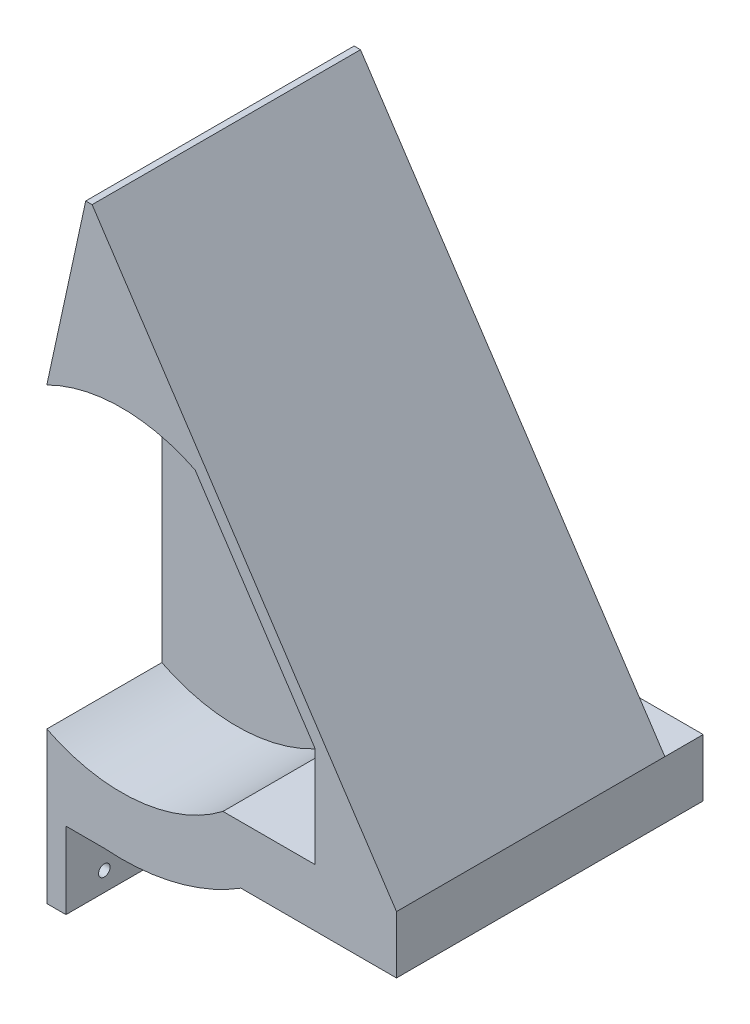
ISO-10303-21;
HEADER;
FILE_DESCRIPTION(('STEP AP214'),'2;1');
FILE_NAME('part.step','',(''),(''),'','','');
FILE_SCHEMA(('AUTOMOTIVE_DESIGN { 1 0 10303 214 1 1 1 1 }'));
ENDSEC;
DATA;
#1=APPLICATION_CONTEXT('core data for automotive mechanical design processes');
#2=APPLICATION_PROTOCOL_DEFINITION('international standard','automotive_design',2000,#1);
#3=PRODUCT_CONTEXT('',#1,'mechanical');
#4=PRODUCT('Part','Part','',(#3));
#5=PRODUCT_RELATED_PRODUCT_CATEGORY('part','',(#4));
#6=PRODUCT_DEFINITION_FORMATION('','',#4);
#7=PRODUCT_DEFINITION_CONTEXT('part definition',#1,'design');
#8=PRODUCT_DEFINITION('design','',#6,#7);
#9=PRODUCT_DEFINITION_SHAPE('','',#8);
#10=(LENGTH_UNIT() NAMED_UNIT(*) SI_UNIT(.MILLI.,.METRE.));
#11=(NAMED_UNIT(*) PLANE_ANGLE_UNIT() SI_UNIT($,.RADIAN.));
#12=(NAMED_UNIT(*) SI_UNIT($,.STERADIAN.) SOLID_ANGLE_UNIT());
#13=UNCERTAINTY_MEASURE_WITH_UNIT(LENGTH_MEASURE(1.E-05),#10,'distance_accuracy_value','');
#14=(GEOMETRIC_REPRESENTATION_CONTEXT(3) GLOBAL_UNCERTAINTY_ASSIGNED_CONTEXT((#13)) GLOBAL_UNIT_ASSIGNED_CONTEXT((#10,
#11,#12)) REPRESENTATION_CONTEXT('',''));
#15=CARTESIAN_POINT('',(0.,0.,0.));
#16=DIRECTION('',(0.,0.,1.));
#17=DIRECTION('',(1.,0.,0.));
#18=AXIS2_PLACEMENT_3D('',#15,#16,#17);
#19=CARTESIAN_POINT('',(15.,-23.7978478395397,-70.0000000000001));
#20=DIRECTION('',(0.,1.,0.));
#21=DIRECTION('',(0.,0.,1.));
#22=AXIS2_PLACEMENT_3D('',#19,#20,#21);
#23=PLANE('',#22);
#24=DIRECTION('',(0.,0.,1.));
#25=VECTOR('',#24,1.);
#26=CARTESIAN_POINT('',(15.,-23.7978478395397,-80.));
#27=LINE('',#26,#25);
#28=CARTESIAN_POINT('',(15.,-23.7978478395397,-80.0000000000001));
#29=VERTEX_POINT('',#28);
#30=CARTESIAN_POINT('',(15.,-23.7978478395397,0.));
#31=VERTEX_POINT('',#30);
#32=EDGE_CURVE('E220',#29,#31,#27,.T.);
#33=ORIENTED_EDGE('',*,*,#32,.T.);
#34=DIRECTION('',(-1.,0.,0.));
#35=VECTOR('',#34,1.);
#36=CARTESIAN_POINT('',(15.,-23.7978478395397,0.));
#37=LINE('',#36,#35);
#38=CARTESIAN_POINT('',(5.,-23.7978478395397,0.));
#39=VERTEX_POINT('',#38);
#40=EDGE_CURVE('E66',#31,#39,#37,.T.);
#41=ORIENTED_EDGE('',*,*,#40,.T.);
#42=DIRECTION('',(0.,0.,1.));
#43=VECTOR('',#42,1.);
#44=CARTESIAN_POINT('',(5.,-23.7978478395397,0.));
#45=LINE('',#44,#43);
#46=CARTESIAN_POINT('',(5.00000000000001,-23.7978478395397,-80.0000000000001));
#47=VERTEX_POINT('',#46);
#48=EDGE_CURVE('E61',#47,#39,#45,.T.);
#49=ORIENTED_EDGE('',*,*,#48,.F.);
#50=DIRECTION('',(-1.,0.,0.));
#51=VECTOR('',#50,1.);
#52=CARTESIAN_POINT('',(15.,-23.7978478395397,-80.0000000000001));
#53=LINE('',#52,#51);
#54=EDGE_CURVE('E200',#29,#47,#53,.T.);
#55=ORIENTED_EDGE('',*,*,#54,.F.);
#56=EDGE_LOOP('',(#33,#41,#49,#55));
#57=FACE_BOUND('',#56,.T.);
#58=ADVANCED_FACE('F45',(#57),#23,.F.);
#59=CARTESIAN_POINT('',(30.,0.,0.));
#60=DIRECTION('',(0.,0.,-1.));
#61=DIRECTION('',(0.,1.,0.));
#62=AXIS2_PLACEMENT_3D('',#59,#60,#61);
#63=PLANE('',#62);
#64=DIRECTION('',(0.,-1.,0.));
#65=VECTOR('',#64,1.);
#66=CARTESIAN_POINT('',(0.,0.,0.));
#67=LINE('',#66,#65);
#68=CARTESIAN_POINT('',(0.,-4.35229791402416,0.));
#69=VERTEX_POINT('',#68);
#70=CARTESIAN_POINT('',(0.,-43.7978478395397,0.));
#71=VERTEX_POINT('',#70);
#72=EDGE_CURVE('E301',#69,#71,#67,.T.);
#73=ORIENTED_EDGE('',*,*,#72,.T.);
#74=DIRECTION('',(-1.,0.,0.));
#75=VECTOR('',#74,1.);
#76=CARTESIAN_POINT('',(0.,-43.7978478395397,0.));
#77=LINE('',#76,#75);
#78=CARTESIAN_POINT('',(5.,-43.7978478395397,0.));
#79=VERTEX_POINT('',#78);
#80=EDGE_CURVE('E187',#79,#71,#77,.T.);
#81=ORIENTED_EDGE('',*,*,#80,.F.);
#82=DIRECTION('',(0.,1.,0.));
#83=VECTOR('',#82,1.);
#84=CARTESIAN_POINT('',(5.,-43.7978478395397,0.));
#85=LINE('',#84,#83);
#86=EDGE_CURVE('E195',#79,#39,#85,.T.);
#87=ORIENTED_EDGE('',*,*,#86,.T.);
#88=ORIENTED_EDGE('',*,*,#40,.F.);
#89=CARTESIAN_POINT('',(19.5000000000004,34.5000000000002,0.));
#90=DIRECTION('',(0.,0.,1.));
#91=DIRECTION('',(1.,0.,0.));
#92=AXIS2_PLACEMENT_3D('',#89,#90,#91);
#93=CIRCLE('',#92,58.471266984068);
#94=CARTESIAN_POINT('',(50.6229668046309,-15.,0.));
#95=VERTEX_POINT('',#94);
#96=EDGE_CURVE('E209',#31,#95,#93,.T.);
#97=ORIENTED_EDGE('',*,*,#96,.T.);
#98=DIRECTION('',(1.,0.,0.));
#99=VECTOR('',#98,1.);
#100=CARTESIAN_POINT('',(0.,-15.,0.));
#101=LINE('',#100,#99);
#102=CARTESIAN_POINT('',(91.2114741888743,-15.,0.));
#103=VERTEX_POINT('',#102);
#104=EDGE_CURVE('E204',#95,#103,#101,.T.);
#105=ORIENTED_EDGE('',*,*,#104,.T.);
#106=DIRECTION('',(0.,1.,0.));
#107=VECTOR('',#106,1.);
#108=CARTESIAN_POINT('',(91.2114741888743,-170.,0.));
#109=LINE('',#108,#107);
#110=CARTESIAN_POINT('',(91.2114741888743,0.,0.));
#111=VERTEX_POINT('',#110);
#112=EDGE_CURVE('E225',#103,#111,#109,.T.);
#113=ORIENTED_EDGE('',*,*,#112,.T.);
#114=DIRECTION('',(-0.551769207168103,0.833996847728505,0.));
#115=VECTOR('',#114,1.);
#116=CARTESIAN_POINT('',(11.8199212825175,120.,0.));
#117=LINE('',#116,#115);
#118=CARTESIAN_POINT('',(11.8199212825175,120.,0.));
#119=VERTEX_POINT('',#118);
#120=EDGE_CURVE('E267',#111,#119,#117,.T.);
#121=ORIENTED_EDGE('',*,*,#120,.T.);
#122=DIRECTION('',(-1.,0.,0.));
#123=VECTOR('',#122,1.);
#124=CARTESIAN_POINT('',(0.,120.,0.));
#125=LINE('',#124,#123);
#126=CARTESIAN_POINT('',(10.1536648631914,120.,0.));
#127=VERTEX_POINT('',#126);
#128=EDGE_CURVE('E260',#119,#127,#125,.T.);
#129=ORIENTED_EDGE('',*,*,#128,.T.);
#130=DIRECTION('',(0.212686858193503,0.977120412411785,0.));
#131=VECTOR('',#130,1.);
#132=CARTESIAN_POINT('',(-15.2441237420009,3.3181425169458,0.));
#133=LINE('',#132,#131);
#134=CARTESIAN_POINT('',(0.,73.3522979140246,0.));
#135=VERTEX_POINT('',#134);
#136=EDGE_CURVE('E254',#135,#127,#133,.T.);
#137=ORIENTED_EDGE('',*,*,#136,.F.);
#138=CARTESIAN_POINT('',(19.5000000000004,34.5000000000002,0.));
#139=DIRECTION('',(0.,0.,1.));
#140=DIRECTION('',(1.,0.,0.));
#141=AXIS2_PLACEMENT_3D('',#138,#139,#140);
#142=CIRCLE('',#141,43.471266984068);
#143=CARTESIAN_POINT('',(38.6845798514309,73.5090111272283,0.));
#144=VERTEX_POINT('',#143);
#145=EDGE_CURVE('E257',#135,#144,#142,.F.);
#146=ORIENTED_EDGE('',*,*,#145,.T.);
#147=DIRECTION('',(0.551769207168103,-0.833996847728505,0.));
#148=VECTOR('',#147,1.);
#149=CARTESIAN_POINT('',(87.3178677347752,0.,0.));
#150=LINE('',#149,#148);
#151=CARTESIAN_POINT('',(70.,26.1758846136216,0.));
#152=VERTEX_POINT('',#151);
#153=EDGE_CURVE('E265',#144,#152,#150,.T.);
#154=ORIENTED_EDGE('',*,*,#153,.T.);
#155=DIRECTION('',(0.,-1.,0.));
#156=VECTOR('',#155,1.);
#157=CARTESIAN_POINT('',(70.,26.1758846136216,0.));
#158=LINE('',#157,#156);
#159=CARTESIAN_POINT('',(70.,0.,0.));
#160=VERTEX_POINT('',#159);
#161=EDGE_CURVE('E235',#152,#160,#158,.T.);
#162=ORIENTED_EDGE('',*,*,#161,.T.);
#163=DIRECTION('',(-1.,0.,0.));
#164=VECTOR('',#163,1.);
#165=CARTESIAN_POINT('',(30.,0.,0.));
#166=LINE('',#165,#164);
#167=CARTESIAN_POINT('',(45.9480822215926,0.,0.));
#168=VERTEX_POINT('',#167);
#169=EDGE_CURVE('E11',#160,#168,#166,.T.);
#170=ORIENTED_EDGE('',*,*,#169,.T.);
#171=CARTESIAN_POINT('',(19.5000000000004,34.5000000000002,0.));
#172=DIRECTION('',(0.,0.,1.));
#173=DIRECTION('',(1.,0.,0.));
#174=AXIS2_PLACEMENT_3D('',#171,#172,#173);
#175=CIRCLE('',#174,43.471266984068);
#176=EDGE_CURVE('E275',#69,#168,#175,.T.);
#177=ORIENTED_EDGE('',*,*,#176,.F.);
#178=EDGE_LOOP('',(#73,#81,#87,#88,#97,#105,#113,#121,#129,#137,#146,#154,#162,#170,#177));
#179=FACE_BOUND('',#178,.T.);
#180=ADVANCED_FACE('F47',(#179),#63,.F.);
#181=CARTESIAN_POINT('',(91.2114741888743,-170.,-80.0000000000001));
#182=DIRECTION('',(-1.,0.,0.));
#183=DIRECTION('',(0.,0.,1.));
#184=AXIS2_PLACEMENT_3D('',#181,#182,#183);
#185=PLANE('',#184);
#186=DIRECTION('',(0.,0.,1.));
#187=VECTOR('',#186,1.);
#188=CARTESIAN_POINT('',(91.2114741888743,-15.,-80.));
#189=LINE('',#188,#187);
#190=CARTESIAN_POINT('',(91.2114741888743,-15.,-80.0000000000001));
#191=VERTEX_POINT('',#190);
#192=EDGE_CURVE('E217',#191,#103,#189,.T.);
#193=ORIENTED_EDGE('',*,*,#192,.F.);
#194=DIRECTION('',(0.,1.,0.));
#195=VECTOR('',#194,1.);
#196=CARTESIAN_POINT('',(91.2114741888743,-170.,-80.0000000000001));
#197=LINE('',#196,#195);
#198=CARTESIAN_POINT('',(91.2114741888743,0.,-80.0000000000001));
#199=VERTEX_POINT('',#198);
#200=EDGE_CURVE('E224',#191,#199,#197,.T.);
#201=ORIENTED_EDGE('',*,*,#200,.T.);
#202=DIRECTION('',(0.,0.,1.));
#203=VECTOR('',#202,1.);
#204=CARTESIAN_POINT('',(91.2114741888743,0.,-80.));
#205=LINE('',#204,#203);
#206=CARTESIAN_POINT('',(91.2114741888743,0.,-70.));
#207=VERTEX_POINT('',#206);
#208=EDGE_CURVE('E219',#199,#207,#205,.T.);
#209=ORIENTED_EDGE('',*,*,#208,.T.);
#210=DIRECTION('',(0.,0.,-1.));
#211=VECTOR('',#210,1.);
#212=CARTESIAN_POINT('',(91.2114741888743,0.,0.));
#213=LINE('',#212,#211);
#214=EDGE_CURVE('E271',#111,#207,#213,.T.);
#215=ORIENTED_EDGE('',*,*,#214,.F.);
#216=ORIENTED_EDGE('',*,*,#112,.F.);
#217=EDGE_LOOP('',(#193,#201,#209,#215,#216));
#218=FACE_BOUND('',#217,.T.);
#219=ADVANCED_FACE('F323',(#218),#185,.F.);
#220=CARTESIAN_POINT('',(0.,-100.282814982748,-32.0135944600556));
#221=DIRECTION('',(1.,0.,0.));
#222=DIRECTION('',(0.,0.,-1.));
#223=AXIS2_PLACEMENT_3D('',#220,#221,#222);
#224=PLANE('',#223);
#225=CARTESIAN_POINT('',(0.,-38.7978478395397,-70.0000000000001));
#226=DIRECTION('',(1.,0.,0.));
#227=DIRECTION('',(0.,0.,-1.));
#228=AXIS2_PLACEMENT_3D('',#225,#226,#227);
#229=CIRCLE('',#228,1.5);
#230=CARTESIAN_POINT('',(0.,-38.7978478395397,-71.5000000000001));
#231=VERTEX_POINT('',#230);
#232=EDGE_CURVE('E189',#231,#231,#229,.T.);
#233=ORIENTED_EDGE('',*,*,#232,.T.);
#234=EDGE_LOOP('',(#233));
#235=FACE_BOUND('',#234,.T.);
#236=CARTESIAN_POINT('',(0.,-38.7978478395397,-9.99999999999999));
#237=DIRECTION('',(1.,0.,0.));
#238=DIRECTION('',(0.,0.,-1.));
#239=AXIS2_PLACEMENT_3D('',#236,#237,#238);
#240=CIRCLE('',#239,1.5);
#241=CARTESIAN_POINT('',(0.,-38.7978478395397,-11.5));
#242=VERTEX_POINT('',#241);
#243=EDGE_CURVE('E426',#242,#242,#240,.T.);
#244=ORIENTED_EDGE('',*,*,#243,.T.);
#245=EDGE_LOOP('',(#244));
#246=FACE_BOUND('',#245,.T.);
#247=DIRECTION('',(0.,-1.,0.));
#248=VECTOR('',#247,1.);
#249=CARTESIAN_POINT('',(0.,120.,-80.0000000000001));
#250=LINE('',#249,#248);
#251=CARTESIAN_POINT('',(0.,0.,-80.0000000000001));
#252=VERTEX_POINT('',#251);
#253=CARTESIAN_POINT('',(0.,-43.7978478395397,-80.0000000000001));
#254=VERTEX_POINT('',#253);
#255=EDGE_CURVE('E162',#252,#254,#250,.T.);
#256=ORIENTED_EDGE('',*,*,#255,.T.);
#257=DIRECTION('',(0.,0.,-1.));
#258=VECTOR('',#257,1.);
#259=CARTESIAN_POINT('',(0.,-43.7978478395397,0.));
#260=LINE('',#259,#258);
#261=EDGE_CURVE('E167',#71,#254,#260,.T.);
#262=ORIENTED_EDGE('',*,*,#261,.F.);
#263=ORIENTED_EDGE('',*,*,#72,.F.);
#264=DIRECTION('',(0.,0.,-1.));
#265=VECTOR('',#264,1.);
#266=CARTESIAN_POINT('',(0.,-4.35229791402416,0.));
#267=LINE('',#266,#265);
#268=CARTESIAN_POINT('',(0.,-4.35229791402416,-30.));
#269=VERTEX_POINT('',#268);
#270=EDGE_CURVE('E283',#269,#69,#267,.F.);
#271=ORIENTED_EDGE('',*,*,#270,.F.);
#272=DIRECTION('',(0.,-1.,0.));
#273=VECTOR('',#272,1.);
#274=CARTESIAN_POINT('',(0.,70.,-30.));
#275=LINE('',#274,#273);
#276=CARTESIAN_POINT('',(0.,73.3522979140246,-30.));
#277=VERTEX_POINT('',#276);
#278=EDGE_CURVE('E287',#277,#269,#275,.T.);
#279=ORIENTED_EDGE('',*,*,#278,.F.);
#280=DIRECTION('',(0.,0.,1.));
#281=VECTOR('',#280,1.);
#282=CARTESIAN_POINT('',(0.,73.3522979140246,-270.));
#283=LINE('',#282,#281);
#284=CARTESIAN_POINT('',(0.,73.3522979140246,-70.0000000000001));
#285=VERTEX_POINT('',#284);
#286=EDGE_CURVE('E248',#285,#277,#283,.T.);
#287=ORIENTED_EDGE('',*,*,#286,.F.);
#288=DIRECTION('',(0.,-1.,0.));
#289=VECTOR('',#288,1.);
#290=CARTESIAN_POINT('',(0.,120.,-70.));
#291=LINE('',#290,#289);
#292=CARTESIAN_POINT('',(0.,0.,-70.0000000000001));
#293=VERTEX_POINT('',#292);
#294=EDGE_CURVE('E296',#285,#293,#291,.T.);
#295=ORIENTED_EDGE('',*,*,#294,.T.);
#296=DIRECTION('',(0.,0.,1.));
#297=VECTOR('',#296,1.);
#298=CARTESIAN_POINT('',(0.,0.,0.));
#299=LINE('',#298,#297);
#300=EDGE_CURVE('E54',#252,#293,#299,.T.);
#301=ORIENTED_EDGE('',*,*,#300,.F.);
#302=EDGE_LOOP('',(#256,#262,#263,#271,#279,#287,#295,#301));
#303=FACE_BOUND('',#302,.T.);
#304=ADVANCED_FACE('F164',(#235,#246,#303),#224,.F.);
#305=CARTESIAN_POINT('',(30.,0.,0.));
#306=DIRECTION('',(0.,-1.,0.));
#307=DIRECTION('',(0.,0.,-1.));
#308=AXIS2_PLACEMENT_3D('',#305,#306,#307);
#309=PLANE('',#308);
#310=ORIENTED_EDGE('',*,*,#208,.F.);
#311=DIRECTION('',(-1.,0.,0.));
#312=VECTOR('',#311,1.);
#313=CARTESIAN_POINT('',(30.,0.,-80.0000000000001));
#314=LINE('',#313,#312);
#315=EDGE_CURVE('E172',#199,#252,#314,.T.);
#316=ORIENTED_EDGE('',*,*,#315,.T.);
#317=ORIENTED_EDGE('',*,*,#300,.T.);
#318=DIRECTION('',(-1.,0.,0.));
#319=VECTOR('',#318,1.);
#320=CARTESIAN_POINT('',(0.,0.,-70.0000000000001));
#321=LINE('',#320,#319);
#322=EDGE_CURVE('E299',#207,#293,#321,.T.);
#323=ORIENTED_EDGE('',*,*,#322,.F.);
#324=EDGE_LOOP('',(#310,#316,#317,#323));
#325=FACE_BOUND('',#324,.T.);
#326=ADVANCED_FACE('F306',(#325),#309,.F.);
#327=CARTESIAN_POINT('',(87.3178677347752,0.,0.));
#328=DIRECTION('',(0.833996847728505,0.551769207168103,0.));
#329=DIRECTION('',(-0.551769207168104,0.833996847728505,0.));
#330=AXIS2_PLACEMENT_3D('',#327,#328,#329);
#331=PLANE('',#330);
#332=ORIENTED_EDGE('',*,*,#153,.F.);
#333=DIRECTION('',(0.,0.,-1.));
#334=VECTOR('',#333,1.);
#335=CARTESIAN_POINT('',(38.6845798514309,73.5090111272283,0.));
#336=LINE('',#335,#334);
#337=CARTESIAN_POINT('',(38.6845798514309,73.5090111272283,-30.));
#338=VERTEX_POINT('',#337);
#339=EDGE_CURVE('E238',#144,#338,#336,.T.);
#340=ORIENTED_EDGE('',*,*,#339,.T.);
#341=DIRECTION('',(0.551769207168103,-0.833996847728505,0.));
#342=VECTOR('',#341,1.);
#343=CARTESIAN_POINT('',(60.7340076946217,40.1813932091887,-30.));
#344=LINE('',#343,#342);
#345=CARTESIAN_POINT('',(70.,26.1758846136215,-30.));
#346=VERTEX_POINT('',#345);
#347=EDGE_CURVE('E243',#338,#346,#344,.T.);
#348=ORIENTED_EDGE('',*,*,#347,.T.);
#349=DIRECTION('',(0.,0.,-1.));
#350=VECTOR('',#349,1.);
#351=CARTESIAN_POINT('',(70.,26.1758846136215,-30.));
#352=LINE('',#351,#350);
#353=EDGE_CURVE('E240',#152,#346,#352,.T.);
#354=ORIENTED_EDGE('',*,*,#353,.F.);
#355=EDGE_LOOP('',(#332,#340,#348,#354));
#356=FACE_BOUND('',#355,.T.);
#357=ADVANCED_FACE('F368',(#356),#331,.F.);
#358=ORIENTED_EDGE('',*,*,#169,.F.);
#359=DIRECTION('',(0.,0.,1.));
#360=VECTOR('',#359,1.);
#361=CARTESIAN_POINT('',(70.,0.,-30.));
#362=LINE('',#361,#360);
#363=CARTESIAN_POINT('',(70.,0.,-30.));
#364=VERTEX_POINT('',#363);
#365=EDGE_CURVE('E294',#364,#160,#362,.T.);
#366=ORIENTED_EDGE('',*,*,#365,.F.);
#367=DIRECTION('',(1.,0.,0.));
#368=VECTOR('',#367,1.);
#369=CARTESIAN_POINT('',(0.,0.,-30.));
#370=LINE('',#369,#368);
#371=CARTESIAN_POINT('',(45.9480822215926,0.,-30.));
#372=VERTEX_POINT('',#371);
#373=EDGE_CURVE('E289',#372,#364,#370,.T.);
#374=ORIENTED_EDGE('',*,*,#373,.F.);
#375=DIRECTION('',(0.,0.,-1.));
#376=VECTOR('',#375,1.);
#377=CARTESIAN_POINT('',(45.9480822215926,0.,0.));
#378=LINE('',#377,#376);
#379=EDGE_CURVE('E285',#168,#372,#378,.T.);
#380=ORIENTED_EDGE('',*,*,#379,.F.);
#381=EDGE_LOOP('',(#358,#366,#374,#380));
#382=FACE_BOUND('',#381,.T.);
#383=ADVANCED_FACE('F350',(#382),#309,.F.);
#384=CARTESIAN_POINT('',(0.,0.,-30.));
#385=DIRECTION('',(0.,0.,1.));
#386=DIRECTION('',(1.,0.,0.));
#387=AXIS2_PLACEMENT_3D('',#384,#385,#386);
#388=PLANE('',#387);
#389=ORIENTED_EDGE('',*,*,#347,.F.);
#390=CARTESIAN_POINT('',(19.5000000000004,34.5000000000002,-30.));
#391=DIRECTION('',(0.,0.,1.));
#392=DIRECTION('',(1.,0.,0.));
#393=AXIS2_PLACEMENT_3D('',#390,#391,#392);
#394=CIRCLE('',#393,43.471266984068);
#395=EDGE_CURVE('E279',#338,#277,#394,.T.);
#396=ORIENTED_EDGE('',*,*,#395,.T.);
#397=ORIENTED_EDGE('',*,*,#278,.T.);
#398=EDGE_CURVE('E274',#269,#372,#394,.T.);
#399=ORIENTED_EDGE('',*,*,#398,.T.);
#400=ORIENTED_EDGE('',*,*,#373,.T.);
#401=DIRECTION('',(0.,1.,0.));
#402=VECTOR('',#401,1.);
#403=CARTESIAN_POINT('',(70.,70.,-30.));
#404=LINE('',#403,#402);
#405=EDGE_CURVE('E291',#364,#346,#404,.T.);
#406=ORIENTED_EDGE('',*,*,#405,.T.);
#407=EDGE_LOOP('',(#389,#396,#397,#399,#400,#406));
#408=FACE_BOUND('',#407,.T.);
#409=ADVANCED_FACE('F346',(#408),#388,.T.);
#410=CARTESIAN_POINT('',(0.,120.,-70.));
#411=DIRECTION('',(0.,0.,1.));
#412=DIRECTION('',(1.,0.,0.));
#413=AXIS2_PLACEMENT_3D('',#410,#411,#412);
#414=PLANE('',#413);
#415=ORIENTED_EDGE('',*,*,#322,.T.);
#416=ORIENTED_EDGE('',*,*,#294,.F.);
#417=DIRECTION('',(0.212686858193503,0.977120412411785,0.));
#418=VECTOR('',#417,1.);
#419=CARTESIAN_POINT('',(9.69435672911133,117.889858559159,-70.));
#420=LINE('',#419,#418);
#421=CARTESIAN_POINT('',(10.1536648631914,120.,-70.0000000000001));
#422=VERTEX_POINT('',#421);
#423=EDGE_CURVE('E251',#285,#422,#420,.T.);
#424=ORIENTED_EDGE('',*,*,#423,.T.);
#425=DIRECTION('',(-1.,0.,0.));
#426=VECTOR('',#425,1.);
#427=CARTESIAN_POINT('',(0.,120.,-70.));
#428=LINE('',#427,#426);
#429=CARTESIAN_POINT('',(11.8199212825175,120.,-70.0000000000001));
#430=VERTEX_POINT('',#429);
#431=EDGE_CURVE('E298',#430,#422,#428,.T.);
#432=ORIENTED_EDGE('',*,*,#431,.F.);
#433=DIRECTION('',(0.551769207168104,-0.833996847728504,0.));
#434=VECTOR('',#433,1.);
#435=CARTESIAN_POINT('',(8.22135501868581,125.439217849399,-70.));
#436=LINE('',#435,#434);
#437=EDGE_CURVE('E245',#430,#207,#436,.T.);
#438=ORIENTED_EDGE('',*,*,#437,.T.);
#439=EDGE_LOOP('',(#415,#416,#424,#432,#438));
#440=FACE_BOUND('',#439,.T.);
#441=ADVANCED_FACE('F311',(#440),#414,.F.);
#442=CARTESIAN_POINT('',(0.,120.,0.));
#443=DIRECTION('',(0.,1.,0.));
#444=DIRECTION('',(0.,0.,1.));
#445=AXIS2_PLACEMENT_3D('',#442,#443,#444);
#446=PLANE('',#445);
#447=DIRECTION('',(0.,0.,-1.));
#448=VECTOR('',#447,1.);
#449=CARTESIAN_POINT('',(11.8199212825175,120.,0.));
#450=LINE('',#449,#448);
#451=EDGE_CURVE('E269',#119,#430,#450,.T.);
#452=ORIENTED_EDGE('',*,*,#451,.T.);
#453=ORIENTED_EDGE('',*,*,#431,.T.);
#454=DIRECTION('',(0.,0.,-1.));
#455=VECTOR('',#454,1.);
#456=CARTESIAN_POINT('',(10.1536648631914,120.,0.));
#457=LINE('',#456,#455);
#458=EDGE_CURVE('E262',#127,#422,#457,.T.);
#459=ORIENTED_EDGE('',*,*,#458,.F.);
#460=ORIENTED_EDGE('',*,*,#128,.F.);
#461=EDGE_LOOP('',(#452,#453,#459,#460));
#462=FACE_BOUND('',#461,.T.);
#463=ADVANCED_FACE('F366',(#462),#446,.T.);
#464=CARTESIAN_POINT('',(70.,70.,-30.));
#465=DIRECTION('',(1.,0.,0.));
#466=DIRECTION('',(0.,1.,0.));
#467=AXIS2_PLACEMENT_3D('',#464,#465,#466);
#468=PLANE('',#467);
#469=ORIENTED_EDGE('',*,*,#365,.T.);
#470=ORIENTED_EDGE('',*,*,#161,.F.);
#471=ORIENTED_EDGE('',*,*,#353,.T.);
#472=ORIENTED_EDGE('',*,*,#405,.F.);
#473=EDGE_LOOP('',(#469,#470,#471,#472));
#474=FACE_BOUND('',#473,.T.);
#475=ADVANCED_FACE('F354',(#474),#468,.F.);
#476=CARTESIAN_POINT('',(19.5000000000004,34.5000000000002,0.));
#477=DIRECTION('',(0.,0.,-1.));
#478=DIRECTION('',(-1.,0.,0.));
#479=AXIS2_PLACEMENT_3D('',#476,#477,#478);
#480=CYLINDRICAL_SURFACE('',#479,43.471266984068);
#481=ORIENTED_EDGE('',*,*,#339,.F.);
#482=ORIENTED_EDGE('',*,*,#145,.F.);
#483=DIRECTION('',(0.,0.,-1.));
#484=VECTOR('',#483,1.);
#485=CARTESIAN_POINT('',(0.,73.3522979140246,0.));
#486=LINE('',#485,#484);
#487=EDGE_CURVE('E278',#135,#277,#486,.T.);
#488=ORIENTED_EDGE('',*,*,#487,.T.);
#489=ORIENTED_EDGE('',*,*,#395,.F.);
#490=EDGE_LOOP('',(#481,#482,#488,#489));
#491=FACE_BOUND('',#490,.T.);
#492=ADVANCED_FACE('F359',(#491),#480,.F.);
#493=ORIENTED_EDGE('',*,*,#379,.T.);
#494=ORIENTED_EDGE('',*,*,#398,.F.);
#495=ORIENTED_EDGE('',*,*,#270,.T.);
#496=ORIENTED_EDGE('',*,*,#176,.T.);
#497=EDGE_LOOP('',(#493,#494,#495,#496));
#498=FACE_BOUND('',#497,.T.);
#499=ADVANCED_FACE('F340',(#498),#480,.F.);
#500=CARTESIAN_POINT('',(11.8199212825175,120.,0.));
#501=DIRECTION('',(-0.833996847728505,-0.551769207168103,0.));
#502=DIRECTION('',(0.551769207168103,-0.833996847728505,0.));
#503=AXIS2_PLACEMENT_3D('',#500,#501,#502);
#504=PLANE('',#503);
#505=ORIENTED_EDGE('',*,*,#214,.T.);
#506=ORIENTED_EDGE('',*,*,#437,.F.);
#507=ORIENTED_EDGE('',*,*,#451,.F.);
#508=ORIENTED_EDGE('',*,*,#120,.F.);
#509=EDGE_LOOP('',(#505,#506,#507,#508));
#510=FACE_BOUND('',#509,.T.);
#511=ADVANCED_FACE('F316',(#510),#504,.F.);
#512=CARTESIAN_POINT('',(-15.2441237420009,3.3181425169458,0.));
#513=DIRECTION('',(-0.977120412411785,0.212686858193502,0.));
#514=DIRECTION('',(-0.212686858193503,-0.977120412411785,0.));
#515=AXIS2_PLACEMENT_3D('',#512,#513,#514);
#516=PLANE('',#515);
#517=ORIENTED_EDGE('',*,*,#458,.T.);
#518=ORIENTED_EDGE('',*,*,#423,.F.);
#519=ORIENTED_EDGE('',*,*,#286,.T.);
#520=ORIENTED_EDGE('',*,*,#487,.F.);
#521=ORIENTED_EDGE('',*,*,#136,.T.);
#522=EDGE_LOOP('',(#517,#518,#519,#520,#521));
#523=FACE_BOUND('',#522,.T.);
#524=ADVANCED_FACE('F363',(#523),#516,.T.);
#525=CARTESIAN_POINT('',(0.,-15.,-80.));
#526=DIRECTION('',(0.,-1.,0.));
#527=DIRECTION('',(0.,0.,-1.));
#528=AXIS2_PLACEMENT_3D('',#525,#526,#527);
#529=PLANE('',#528);
#530=ORIENTED_EDGE('',*,*,#104,.F.);
#531=DIRECTION('',(0.,0.,1.));
#532=VECTOR('',#531,1.);
#533=CARTESIAN_POINT('',(50.6229668046309,-15.,-80.));
#534=LINE('',#533,#532);
#535=CARTESIAN_POINT('',(50.6229668046309,-15.,-80.));
#536=VERTEX_POINT('',#535);
#537=EDGE_CURVE('E212',#536,#95,#534,.T.);
#538=ORIENTED_EDGE('',*,*,#537,.F.);
#539=DIRECTION('',(1.,0.,0.));
#540=VECTOR('',#539,1.);
#541=CARTESIAN_POINT('',(0.,-15.,-80.));
#542=LINE('',#541,#540);
#543=EDGE_CURVE('E205',#536,#191,#542,.T.);
#544=ORIENTED_EDGE('',*,*,#543,.T.);
#545=ORIENTED_EDGE('',*,*,#192,.T.);
#546=EDGE_LOOP('',(#530,#538,#544,#545));
#547=FACE_BOUND('',#546,.T.);
#548=ADVANCED_FACE('F327',(#547),#529,.T.);
#549=CARTESIAN_POINT('',(19.5000000000004,34.5000000000002,-80.));
#550=DIRECTION('',(0.,0.,1.));
#551=DIRECTION('',(1.,0.,0.));
#552=AXIS2_PLACEMENT_3D('',#549,#550,#551);
#553=CYLINDRICAL_SURFACE('',#552,58.471266984068);
#554=ORIENTED_EDGE('',*,*,#96,.F.);
#555=ORIENTED_EDGE('',*,*,#32,.F.);
#556=CARTESIAN_POINT('',(19.5000000000004,34.5000000000002,-80.));
#557=DIRECTION('',(0.,0.,1.));
#558=DIRECTION('',(1.,0.,0.));
#559=AXIS2_PLACEMENT_3D('',#556,#557,#558);
#560=CIRCLE('',#559,58.471266984068);
#561=EDGE_CURVE('E208',#29,#536,#560,.T.);
#562=ORIENTED_EDGE('',*,*,#561,.T.);
#563=ORIENTED_EDGE('',*,*,#537,.T.);
#564=EDGE_LOOP('',(#554,#555,#562,#563));
#565=FACE_BOUND('',#564,.T.);
#566=ADVANCED_FACE('F330',(#565),#553,.T.);
#567=CARTESIAN_POINT('',(0.,-151.582814982748,-80.0000000000001));
#568=DIRECTION('',(0.,0.,1.));
#569=DIRECTION('',(1.,0.,0.));
#570=AXIS2_PLACEMENT_3D('',#567,#568,#569);
#571=PLANE('',#570);
#572=CARTESIAN_POINT('',(76.2114741888743,-7.5,-80.0000000000001));
#573=DIRECTION('',(0.,0.,-1.));
#574=DIRECTION('',(-1.,0.,0.));
#575=AXIS2_PLACEMENT_3D('',#572,#573,#574);
#576=CIRCLE('',#575,1.5);
#577=CARTESIAN_POINT('',(74.7114741888743,-7.5,-80.0000000000001));
#578=VERTEX_POINT('',#577);
#579=EDGE_CURVE('E442',#578,#578,#576,.T.);
#580=ORIENTED_EDGE('',*,*,#579,.F.);
#581=EDGE_LOOP('',(#580));
#582=FACE_BOUND('',#581,.T.);
#583=CARTESIAN_POINT('',(15.,-7.5,-80.0000000000001));
#584=DIRECTION('',(0.,0.,-1.));
#585=DIRECTION('',(-1.,0.,0.));
#586=AXIS2_PLACEMENT_3D('',#583,#584,#585);
#587=CIRCLE('',#586,1.5);
#588=CARTESIAN_POINT('',(13.5,-7.5,-80.0000000000001));
#589=VERTEX_POINT('',#588);
#590=EDGE_CURVE('E439',#589,#589,#587,.T.);
#591=ORIENTED_EDGE('',*,*,#590,.F.);
#592=EDGE_LOOP('',(#591));
#593=FACE_BOUND('',#592,.T.);
#594=ORIENTED_EDGE('',*,*,#561,.F.);
#595=ORIENTED_EDGE('',*,*,#54,.T.);
#596=DIRECTION('',(0.,1.,0.));
#597=VECTOR('',#596,1.);
#598=CARTESIAN_POINT('',(5.00000000000001,-43.7978478395397,-80.0000000000001));
#599=LINE('',#598,#597);
#600=CARTESIAN_POINT('',(5.00000000000001,-43.7978478395397,-80.0000000000001));
#601=VERTEX_POINT('',#600);
#602=EDGE_CURVE('E179',#601,#47,#599,.T.);
#603=ORIENTED_EDGE('',*,*,#602,.F.);
#604=DIRECTION('',(1.,0.,0.));
#605=VECTOR('',#604,1.);
#606=CARTESIAN_POINT('',(0.,-43.7978478395397,-80.0000000000001));
#607=LINE('',#606,#605);
#608=EDGE_CURVE('E175',#254,#601,#607,.T.);
#609=ORIENTED_EDGE('',*,*,#608,.F.);
#610=ORIENTED_EDGE('',*,*,#255,.F.);
#611=ORIENTED_EDGE('',*,*,#315,.F.);
#612=ORIENTED_EDGE('',*,*,#200,.F.);
#613=ORIENTED_EDGE('',*,*,#543,.F.);
#614=EDGE_LOOP('',(#594,#595,#603,#609,#610,#611,#612,#613));
#615=FACE_BOUND('',#614,.T.);
#616=ADVANCED_FACE('F177',(#582,#593,#615),#571,.F.);
#617=CARTESIAN_POINT('',(5.,-43.7978478395397,0.));
#618=DIRECTION('',(-1.,0.,0.));
#619=DIRECTION('',(0.,0.,1.));
#620=AXIS2_PLACEMENT_3D('',#617,#618,#619);
#621=PLANE('',#620);
#622=CARTESIAN_POINT('',(5.00000000000001,-38.7978478395397,-70.0000000000001));
#623=DIRECTION('',(1.,0.,0.));
#624=DIRECTION('',(0.,0.,-1.));
#625=AXIS2_PLACEMENT_3D('',#622,#623,#624);
#626=CIRCLE('',#625,1.5);
#627=CARTESIAN_POINT('',(5.00000000000001,-38.7978478395397,-71.5000000000001));
#628=VERTEX_POINT('',#627);
#629=EDGE_CURVE('E428',#628,#628,#626,.T.);
#630=ORIENTED_EDGE('',*,*,#629,.F.);
#631=EDGE_LOOP('',(#630));
#632=FACE_BOUND('',#631,.T.);
#633=CARTESIAN_POINT('',(5.,-38.7978478395397,-9.99999999999999));
#634=DIRECTION('',(1.,0.,0.));
#635=DIRECTION('',(0.,0.,1.));
#636=AXIS2_PLACEMENT_3D('',#633,#634,#635);
#637=CIRCLE('',#636,1.5);
#638=CARTESIAN_POINT('',(5.,-38.7978478395397,-8.5));
#639=VERTEX_POINT('',#638);
#640=EDGE_CURVE('E430',#639,#639,#637,.T.);
#641=ORIENTED_EDGE('',*,*,#640,.F.);
#642=EDGE_LOOP('',(#641));
#643=FACE_BOUND('',#642,.T.);
#644=ORIENTED_EDGE('',*,*,#48,.T.);
#645=ORIENTED_EDGE('',*,*,#86,.F.);
#646=DIRECTION('',(0.,0.,1.));
#647=VECTOR('',#646,1.);
#648=CARTESIAN_POINT('',(5.,-43.7978478395397,0.));
#649=LINE('',#648,#647);
#650=EDGE_CURVE('E182',#601,#79,#649,.T.);
#651=ORIENTED_EDGE('',*,*,#650,.F.);
#652=ORIENTED_EDGE('',*,*,#602,.T.);
#653=EDGE_LOOP('',(#644,#645,#651,#652));
#654=FACE_BOUND('',#653,.T.);
#655=ADVANCED_FACE('F333',(#632,#643,#654),#621,.F.);
#656=CARTESIAN_POINT('',(0.,-43.7978478395397,0.));
#657=DIRECTION('',(0.,-1.,0.));
#658=DIRECTION('',(0.,0.,-1.));
#659=AXIS2_PLACEMENT_3D('',#656,#657,#658);
#660=PLANE('',#659);
#661=ORIENTED_EDGE('',*,*,#261,.T.);
#662=ORIENTED_EDGE('',*,*,#608,.T.);
#663=ORIENTED_EDGE('',*,*,#650,.T.);
#664=ORIENTED_EDGE('',*,*,#80,.T.);
#665=EDGE_LOOP('',(#661,#662,#663,#664));
#666=FACE_BOUND('',#665,.T.);
#667=ADVANCED_FACE('F185',(#666),#660,.T.);
#668=CARTESIAN_POINT('',(-15.,-38.7978478395397,-10.));
#669=DIRECTION('',(1.,0.,0.));
#670=DIRECTION('',(0.,0.,-1.));
#671=AXIS2_PLACEMENT_3D('',#668,#669,#670);
#672=CYLINDRICAL_SURFACE('',#671,1.5);
#673=ORIENTED_EDGE('',*,*,#640,.T.);
#674=EDGE_LOOP('',(#673));
#675=FACE_BOUND('',#674,.T.);
#676=ORIENTED_EDGE('',*,*,#243,.F.);
#677=EDGE_LOOP('',(#676));
#678=FACE_BOUND('',#677,.T.);
#679=ADVANCED_FACE('F470',(#675,#678),#672,.F.);
#680=CARTESIAN_POINT('',(-15.,-38.7978478395397,-70.0000000000001));
#681=DIRECTION('',(1.,0.,0.));
#682=DIRECTION('',(0.,0.,-1.));
#683=AXIS2_PLACEMENT_3D('',#680,#681,#682);
#684=CYLINDRICAL_SURFACE('',#683,1.5);
#685=ORIENTED_EDGE('',*,*,#629,.T.);
#686=EDGE_LOOP('',(#685));
#687=FACE_BOUND('',#686,.T.);
#688=ORIENTED_EDGE('',*,*,#232,.F.);
#689=EDGE_LOOP('',(#688));
#690=FACE_BOUND('',#689,.T.);
#691=ADVANCED_FACE('F461',(#687,#690),#684,.F.);
#692=CARTESIAN_POINT('',(15.,-7.5,-70.0000000000001));
#693=DIRECTION('',(0.,0.,-1.));
#694=DIRECTION('',(-1.,0.,0.));
#695=AXIS2_PLACEMENT_3D('',#692,#693,#694);
#696=CYLINDRICAL_SURFACE('',#695,1.5);
#697=CARTESIAN_POINT('',(15.,-7.5,-70.0000000000001));
#698=DIRECTION('',(0.,0.,-1.));
#699=DIRECTION('',(-1.,0.,0.));
#700=AXIS2_PLACEMENT_3D('',#697,#698,#699);
#701=CIRCLE('',#700,1.5);
#702=CARTESIAN_POINT('',(13.5,-7.5,-70.0000000000001));
#703=VERTEX_POINT('',#702);
#704=EDGE_CURVE('E436',#703,#703,#701,.T.);
#705=ORIENTED_EDGE('',*,*,#704,.F.);
#706=EDGE_LOOP('',(#705));
#707=FACE_BOUND('',#706,.T.);
#708=ORIENTED_EDGE('',*,*,#590,.T.);
#709=EDGE_LOOP('',(#708));
#710=FACE_BOUND('',#709,.T.);
#711=ADVANCED_FACE('F459',(#707,#710),#696,.F.);
#712=CARTESIAN_POINT('',(15.,-7.5,-70.0000000000001));
#713=DIRECTION('',(0.,0.,-1.));
#714=DIRECTION('',(-1.,0.,0.));
#715=AXIS2_PLACEMENT_3D('',#712,#713,#714);
#716=PLANE('',#715);
#717=ORIENTED_EDGE('',*,*,#704,.T.);
#718=EDGE_LOOP('',(#717));
#719=FACE_BOUND('',#718,.T.);
#720=ADVANCED_FACE('F453',(#719),#716,.T.);
#721=CARTESIAN_POINT('',(76.2114741888743,-7.5,-70.0000000000001));
#722=DIRECTION('',(0.,0.,-1.));
#723=DIRECTION('',(-1.,0.,0.));
#724=AXIS2_PLACEMENT_3D('',#721,#722,#723);
#725=CYLINDRICAL_SURFACE('',#724,1.5);
#726=CARTESIAN_POINT('',(76.2114741888743,-7.5,-70.0000000000001));
#727=DIRECTION('',(0.,0.,-1.));
#728=DIRECTION('',(-1.,0.,0.));
#729=AXIS2_PLACEMENT_3D('',#726,#727,#728);
#730=CIRCLE('',#729,1.5);
#731=CARTESIAN_POINT('',(74.7114741888743,-7.5,-70.0000000000001));
#732=VERTEX_POINT('',#731);
#733=EDGE_CURVE('E434',#732,#732,#730,.T.);
#734=ORIENTED_EDGE('',*,*,#733,.F.);
#735=EDGE_LOOP('',(#734));
#736=FACE_BOUND('',#735,.T.);
#737=ORIENTED_EDGE('',*,*,#579,.T.);
#738=EDGE_LOOP('',(#737));
#739=FACE_BOUND('',#738,.T.);
#740=ADVANCED_FACE('F450',(#736,#739),#725,.F.);
#741=CARTESIAN_POINT('',(76.2114741888743,-7.5,-70.0000000000001));
#742=DIRECTION('',(0.,0.,-1.));
#743=DIRECTION('',(-1.,0.,0.));
#744=AXIS2_PLACEMENT_3D('',#741,#742,#743);
#745=PLANE('',#744);
#746=ORIENTED_EDGE('',*,*,#733,.T.);
#747=EDGE_LOOP('',(#746));
#748=FACE_BOUND('',#747,.T.);
#749=ADVANCED_FACE('F448',(#748),#745,.T.);
#750=CLOSED_SHELL('',(#58,#180,#219,#304,#326,#357,#383,#409,#441,#463,#475,#492,#499,#511,#524,
#548,#566,#616,#655,#667,#679,#691,#711,#720,#740,#749));
#751=CARTESIAN_POINT('',(20.,35.,-60.));
#752=DIRECTION('',(0.,0.,-1.));
#753=DIRECTION('',(-1.,0.,0.));
#754=AXIS2_PLACEMENT_3D('',#751,#752,#753);
#755=PLANE('',#754);
#756=CARTESIAN_POINT('',(20.,35.,-60.));
#757=DIRECTION('',(0.,0.,1.));
#758=DIRECTION('',(-1.,0.,0.));
#759=AXIS2_PLACEMENT_3D('',#756,#757,#758);
#760=CIRCLE('',#759,15.);
#761=CARTESIAN_POINT('',(5.00000000000003,35.,-60.0000000000001));
#762=VERTEX_POINT('',#761);
#763=EDGE_CURVE('E227',#762,#762,#760,.T.);
#764=ORIENTED_EDGE('',*,*,#763,.T.);
#765=EDGE_LOOP('',(#764));
#766=FACE_BOUND('',#765,.T.);
#767=ADVANCED_FACE('F476',(#766),#755,.F.);
#768=CARTESIAN_POINT('',(0.,0.,-50.));
#769=DIRECTION('',(0.,0.,1.));
#770=DIRECTION('',(1.,0.,0.));
#771=AXIS2_PLACEMENT_3D('',#768,#769,#770);
#772=PLANE('',#771);
#773=CARTESIAN_POINT('',(20.,35.,-50.));
#774=DIRECTION('',(0.,0.,1.));
#775=DIRECTION('',(1.,0.,0.));
#776=AXIS2_PLACEMENT_3D('',#773,#774,#775);
#777=CIRCLE('',#776,15.);
#778=CARTESIAN_POINT('',(35.,35.,-50.));
#779=VERTEX_POINT('',#778);
#780=EDGE_CURVE('E232',#779,#779,#777,.T.);
#781=ORIENTED_EDGE('',*,*,#780,.F.);
#782=EDGE_LOOP('',(#781));
#783=FACE_BOUND('',#782,.T.);
#784=ADVANCED_FACE('F397',(#783),#772,.F.);
#785=CARTESIAN_POINT('',(20.,35.,0.));
#786=DIRECTION('',(0.,0.,-1.));
#787=DIRECTION('',(-1.,0.,0.));
#788=AXIS2_PLACEMENT_3D('',#785,#786,#787);
#789=CYLINDRICAL_SURFACE('',#788,15.);
#790=ORIENTED_EDGE('',*,*,#780,.T.);
#791=EDGE_LOOP('',(#790));
#792=FACE_BOUND('',#791,.T.);
#793=ORIENTED_EDGE('',*,*,#763,.F.);
#794=EDGE_LOOP('',(#793));
#795=FACE_BOUND('',#794,.T.);
#796=ADVANCED_FACE('F394',(#792,#795),#789,.F.);
#797=CLOSED_SHELL('',(#767,#784,#796));
#798=ORIENTED_CLOSED_SHELL('',*,#797,.T.);
#799=BREP_WITH_VOIDS('B2',#750,(#798));
#800=ADVANCED_BREP_SHAPE_REPRESENTATION('',(#18,#799),#14);
#801=SHAPE_DEFINITION_REPRESENTATION(#9,#800);
ENDSEC;
END-ISO-10303-21;
